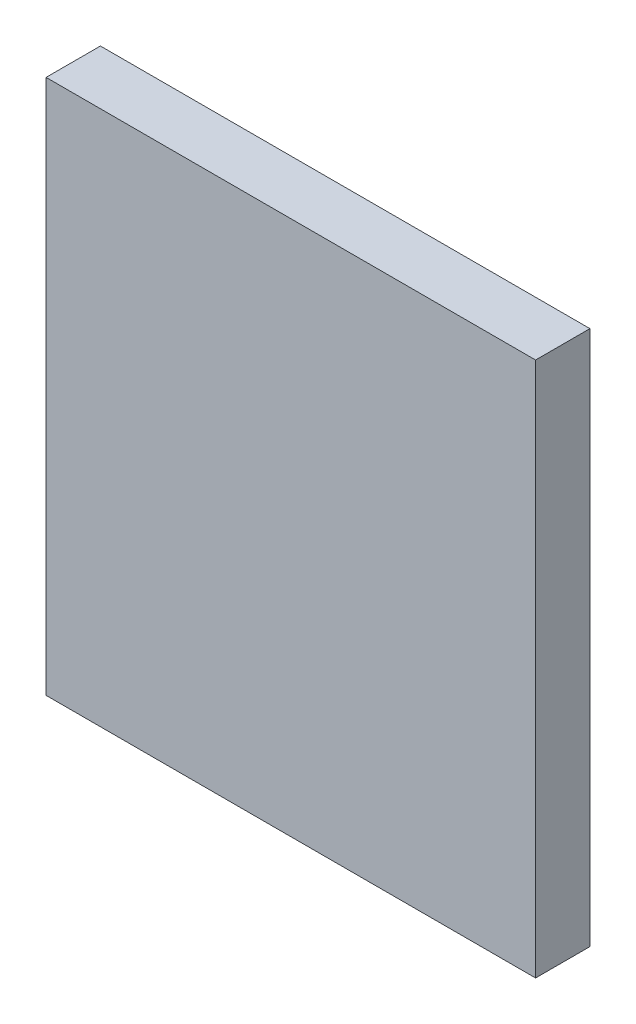
ISO-10303-21;
HEADER;
FILE_DESCRIPTION(('STEP AP214'),'2;1');
FILE_NAME('part.step','',(''),(''),'','','');
FILE_SCHEMA(('AUTOMOTIVE_DESIGN { 1 0 10303 214 1 1 1 1 }'));
ENDSEC;
DATA;
#1=APPLICATION_CONTEXT('core data for automotive mechanical design processes');
#2=APPLICATION_PROTOCOL_DEFINITION('international standard','automotive_design',2000,#1);
#3=PRODUCT_CONTEXT('',#1,'mechanical');
#4=PRODUCT('Part','Part','',(#3));
#5=PRODUCT_RELATED_PRODUCT_CATEGORY('part','',(#4));
#6=PRODUCT_DEFINITION_FORMATION('','',#4);
#7=PRODUCT_DEFINITION_CONTEXT('part definition',#1,'design');
#8=PRODUCT_DEFINITION('design','',#6,#7);
#9=PRODUCT_DEFINITION_SHAPE('','',#8);
#10=(LENGTH_UNIT() NAMED_UNIT(*) SI_UNIT(.MILLI.,.METRE.));
#11=(NAMED_UNIT(*) PLANE_ANGLE_UNIT() SI_UNIT($,.RADIAN.));
#12=(NAMED_UNIT(*) SI_UNIT($,.STERADIAN.) SOLID_ANGLE_UNIT());
#13=UNCERTAINTY_MEASURE_WITH_UNIT(LENGTH_MEASURE(1.E-05),#10,'distance_accuracy_value','');
#14=(GEOMETRIC_REPRESENTATION_CONTEXT(3) GLOBAL_UNCERTAINTY_ASSIGNED_CONTEXT((#13)) GLOBAL_UNIT_ASSIGNED_CONTEXT((#10,
#11,#12)) REPRESENTATION_CONTEXT('',''));
#15=CARTESIAN_POINT('',(0.,0.,0.));
#16=DIRECTION('',(0.,0.,1.));
#17=DIRECTION('',(1.,0.,0.));
#18=AXIS2_PLACEMENT_3D('',#15,#16,#17);
#19=CARTESIAN_POINT('',(-6.4017,-4.8999,1.));
#20=DIRECTION('',(1.,0.,0.));
#21=DIRECTION('',(0.,0.,-1.));
#22=AXIS2_PLACEMENT_3D('',#19,#20,#21);
#23=PLANE('',#22);
#24=DIRECTION('',(0.,-1.,0.));
#25=VECTOR('',#24,1.);
#26=CARTESIAN_POINT('',(-6.4017,-4.8999,0.));
#27=LINE('',#26,#25);
#28=CARTESIAN_POINT('',(-6.4017,4.950103,0.));
#29=VERTEX_POINT('',#28);
#30=CARTESIAN_POINT('',(-6.4017,-4.8999,0.));
#31=VERTEX_POINT('',#30);
#32=EDGE_CURVE('E95',#29,#31,#27,.T.);
#33=ORIENTED_EDGE('',*,*,#32,.T.);
#34=DIRECTION('',(0.,0.,-1.));
#35=VECTOR('',#34,1.);
#36=CARTESIAN_POINT('',(-6.4017,-4.8999,1.));
#37=LINE('',#36,#35);
#38=CARTESIAN_POINT('',(-6.4017,-4.8999,1.));
#39=VERTEX_POINT('',#38);
#40=EDGE_CURVE('E11',#39,#31,#37,.T.);
#41=ORIENTED_EDGE('',*,*,#40,.F.);
#42=DIRECTION('',(0.,-1.,0.));
#43=VECTOR('',#42,1.);
#44=CARTESIAN_POINT('',(-6.4017,-4.8999,1.));
#45=LINE('',#44,#43);
#46=CARTESIAN_POINT('',(-6.4017,4.950103,1.));
#47=VERTEX_POINT('',#46);
#48=EDGE_CURVE('E83',#47,#39,#45,.T.);
#49=ORIENTED_EDGE('',*,*,#48,.F.);
#50=DIRECTION('',(0.,0.,-1.));
#51=VECTOR('',#50,1.);
#52=CARTESIAN_POINT('',(-6.4017,4.950103,1.));
#53=LINE('',#52,#51);
#54=EDGE_CURVE('E91',#47,#29,#53,.T.);
#55=ORIENTED_EDGE('',*,*,#54,.T.);
#56=EDGE_LOOP('',(#33,#41,#49,#55));
#57=FACE_BOUND('',#56,.T.);
#58=ADVANCED_FACE('F32',(#57),#23,.F.);
#59=CARTESIAN_POINT('',(2.6072,-4.8999,1.));
#60=DIRECTION('',(0.,1.,0.));
#61=DIRECTION('',(0.,0.,1.));
#62=AXIS2_PLACEMENT_3D('',#59,#60,#61);
#63=PLANE('',#62);
#64=DIRECTION('',(1.,0.,0.));
#65=VECTOR('',#64,1.);
#66=CARTESIAN_POINT('',(2.6072,-4.8999,0.));
#67=LINE('',#66,#65);
#68=CARTESIAN_POINT('',(2.6072,-4.8999,0.));
#69=VERTEX_POINT('',#68);
#70=EDGE_CURVE('E87',#31,#69,#67,.T.);
#71=ORIENTED_EDGE('',*,*,#70,.T.);
#72=DIRECTION('',(0.,0.,-1.));
#73=VECTOR('',#72,1.);
#74=CARTESIAN_POINT('',(2.6072,-4.8999,1.));
#75=LINE('',#74,#73);
#76=CARTESIAN_POINT('',(2.6072,-4.8999,1.));
#77=VERTEX_POINT('',#76);
#78=EDGE_CURVE('E40',#77,#69,#75,.T.);
#79=ORIENTED_EDGE('',*,*,#78,.F.);
#80=DIRECTION('',(1.,0.,0.));
#81=VECTOR('',#80,1.);
#82=CARTESIAN_POINT('',(2.6072,-4.8999,1.));
#83=LINE('',#82,#81);
#84=EDGE_CURVE('E78',#39,#77,#83,.T.);
#85=ORIENTED_EDGE('',*,*,#84,.F.);
#86=ORIENTED_EDGE('',*,*,#40,.T.);
#87=EDGE_LOOP('',(#71,#79,#85,#86));
#88=FACE_BOUND('',#87,.T.);
#89=ADVANCED_FACE('F86',(#88),#63,.F.);
#90=CARTESIAN_POINT('',(2.6072,4.950103,1.));
#91=DIRECTION('',(-1.,0.,0.));
#92=DIRECTION('',(0.,0.,1.));
#93=AXIS2_PLACEMENT_3D('',#90,#91,#92);
#94=PLANE('',#93);
#95=DIRECTION('',(0.,1.,0.));
#96=VECTOR('',#95,1.);
#97=CARTESIAN_POINT('',(2.6072,4.950103,0.));
#98=LINE('',#97,#96);
#99=CARTESIAN_POINT('',(2.6072,4.950103,0.));
#100=VERTEX_POINT('',#99);
#101=EDGE_CURVE('E65',#69,#100,#98,.T.);
#102=ORIENTED_EDGE('',*,*,#101,.T.);
#103=DIRECTION('',(0.,0.,-1.));
#104=VECTOR('',#103,1.);
#105=CARTESIAN_POINT('',(2.6072,4.950103,1.));
#106=LINE('',#105,#104);
#107=CARTESIAN_POINT('',(2.6072,4.950103,1.));
#108=VERTEX_POINT('',#107);
#109=EDGE_CURVE('E88',#108,#100,#106,.T.);
#110=ORIENTED_EDGE('',*,*,#109,.F.);
#111=DIRECTION('',(0.,1.,0.));
#112=VECTOR('',#111,1.);
#113=CARTESIAN_POINT('',(2.6072,4.950103,1.));
#114=LINE('',#113,#112);
#115=EDGE_CURVE('E81',#77,#108,#114,.T.);
#116=ORIENTED_EDGE('',*,*,#115,.F.);
#117=ORIENTED_EDGE('',*,*,#78,.T.);
#118=EDGE_LOOP('',(#102,#110,#116,#117));
#119=FACE_BOUND('',#118,.T.);
#120=ADVANCED_FACE('F89',(#119),#94,.F.);
#121=CARTESIAN_POINT('',(-6.4017,4.950103,1.));
#122=DIRECTION('',(0.,-1.,0.));
#123=DIRECTION('',(0.,0.,-1.));
#124=AXIS2_PLACEMENT_3D('',#121,#122,#123);
#125=PLANE('',#124);
#126=DIRECTION('',(-1.,0.,0.));
#127=VECTOR('',#126,1.);
#128=CARTESIAN_POINT('',(-6.4017,4.950103,0.));
#129=LINE('',#128,#127);
#130=EDGE_CURVE('E71',#100,#29,#129,.T.);
#131=ORIENTED_EDGE('',*,*,#130,.T.);
#132=ORIENTED_EDGE('',*,*,#54,.F.);
#133=DIRECTION('',(-1.,0.,0.));
#134=VECTOR('',#133,1.);
#135=CARTESIAN_POINT('',(-6.4017,4.950103,1.));
#136=LINE('',#135,#134);
#137=EDGE_CURVE('E48',#108,#47,#136,.T.);
#138=ORIENTED_EDGE('',*,*,#137,.F.);
#139=ORIENTED_EDGE('',*,*,#109,.T.);
#140=EDGE_LOOP('',(#131,#132,#138,#139));
#141=FACE_BOUND('',#140,.T.);
#142=ADVANCED_FACE('F102',(#141),#125,.F.);
#143=CARTESIAN_POINT('',(0.,0.,1.));
#144=DIRECTION('',(0.,0.,-1.));
#145=DIRECTION('',(-1.,0.,0.));
#146=AXIS2_PLACEMENT_3D('',#143,#144,#145);
#147=PLANE('',#146);
#148=ORIENTED_EDGE('',*,*,#48,.T.);
#149=ORIENTED_EDGE('',*,*,#84,.T.);
#150=ORIENTED_EDGE('',*,*,#115,.T.);
#151=ORIENTED_EDGE('',*,*,#137,.T.);
#152=EDGE_LOOP('',(#148,#149,#150,#151));
#153=FACE_BOUND('',#152,.T.);
#154=ADVANCED_FACE('F79',(#153),#147,.F.);
#155=CARTESIAN_POINT('',(0.,0.,0.));
#156=DIRECTION('',(0.,0.,-1.));
#157=DIRECTION('',(-1.,0.,0.));
#158=AXIS2_PLACEMENT_3D('',#155,#156,#157);
#159=PLANE('',#158);
#160=ORIENTED_EDGE('',*,*,#32,.F.);
#161=ORIENTED_EDGE('',*,*,#130,.F.);
#162=ORIENTED_EDGE('',*,*,#101,.F.);
#163=ORIENTED_EDGE('',*,*,#70,.F.);
#164=EDGE_LOOP('',(#160,#161,#162,#163));
#165=FACE_BOUND('',#164,.T.);
#166=ADVANCED_FACE('F105',(#165),#159,.T.);
#167=CLOSED_SHELL('',(#58,#89,#120,#142,#154,#166));
#168=MANIFOLD_SOLID_BREP('B2',#167);
#169=ADVANCED_BREP_SHAPE_REPRESENTATION('',(#18,#168),#14);
#170=SHAPE_DEFINITION_REPRESENTATION(#9,#169);
ENDSEC;
END-ISO-10303-21;
